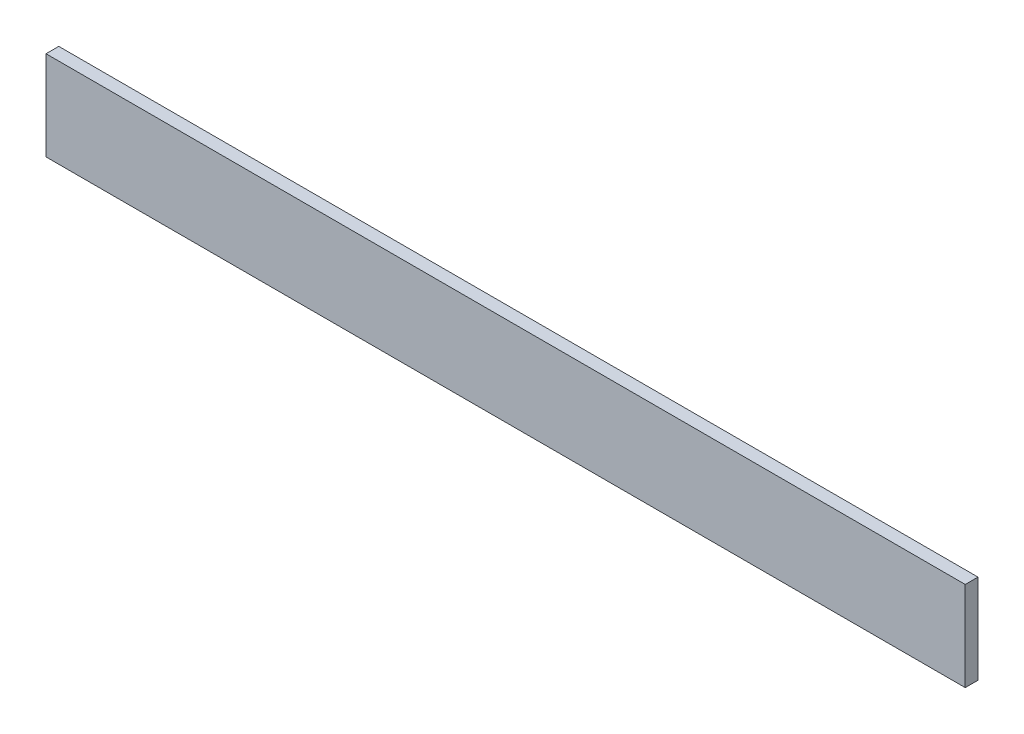
ISO-10303-21;
HEADER;
FILE_DESCRIPTION(('STEP AP214'),'2;1');
FILE_NAME('part.step','',(''),(''),'','','');
FILE_SCHEMA(('AUTOMOTIVE_DESIGN { 1 0 10303 214 1 1 1 1 }'));
ENDSEC;
DATA;
#1=APPLICATION_CONTEXT('core data for automotive mechanical design processes');
#2=APPLICATION_PROTOCOL_DEFINITION('international standard','automotive_design',2000,#1);
#3=PRODUCT_CONTEXT('',#1,'mechanical');
#4=PRODUCT('Part','Part','',(#3));
#5=PRODUCT_RELATED_PRODUCT_CATEGORY('part','',(#4));
#6=PRODUCT_DEFINITION_FORMATION('','',#4);
#7=PRODUCT_DEFINITION_CONTEXT('part definition',#1,'design');
#8=PRODUCT_DEFINITION('design','',#6,#7);
#9=PRODUCT_DEFINITION_SHAPE('','',#8);
#10=(LENGTH_UNIT() NAMED_UNIT(*) SI_UNIT(.MILLI.,.METRE.));
#11=(NAMED_UNIT(*) PLANE_ANGLE_UNIT() SI_UNIT($,.RADIAN.));
#12=(NAMED_UNIT(*) SI_UNIT($,.STERADIAN.) SOLID_ANGLE_UNIT());
#13=UNCERTAINTY_MEASURE_WITH_UNIT(LENGTH_MEASURE(1.E-05),#10,'distance_accuracy_value','');
#14=(GEOMETRIC_REPRESENTATION_CONTEXT(3) GLOBAL_UNCERTAINTY_ASSIGNED_CONTEXT((#13)) GLOBAL_UNIT_ASSIGNED_CONTEXT((#10,
#11,#12)) REPRESENTATION_CONTEXT('',''));
#15=CARTESIAN_POINT('',(0.,0.,0.));
#16=DIRECTION('',(0.,0.,1.));
#17=DIRECTION('',(1.,0.,0.));
#18=AXIS2_PLACEMENT_3D('',#15,#16,#17);
#19=CARTESIAN_POINT('',(0.,0.,2.5));
#20=DIRECTION('',(1.,0.,0.));
#21=DIRECTION('',(0.,0.,-1.));
#22=AXIS2_PLACEMENT_3D('',#19,#20,#21);
#23=PLANE('',#22);
#24=DIRECTION('',(0.,-1.,0.));
#25=VECTOR('',#24,1.);
#26=CARTESIAN_POINT('',(0.,0.,0.));
#27=LINE('',#26,#25);
#28=CARTESIAN_POINT('',(0.,17.5,0.));
#29=VERTEX_POINT('',#28);
#30=CARTESIAN_POINT('',(0.,0.,0.));
#31=VERTEX_POINT('',#30);
#32=EDGE_CURVE('E95',#29,#31,#27,.T.);
#33=ORIENTED_EDGE('',*,*,#32,.T.);
#34=DIRECTION('',(0.,0.,-1.));
#35=VECTOR('',#34,1.);
#36=CARTESIAN_POINT('',(0.,0.,2.5));
#37=LINE('',#36,#35);
#38=CARTESIAN_POINT('',(0.,0.,2.5));
#39=VERTEX_POINT('',#38);
#40=EDGE_CURVE('E11',#39,#31,#37,.T.);
#41=ORIENTED_EDGE('',*,*,#40,.F.);
#42=DIRECTION('',(0.,-1.,0.));
#43=VECTOR('',#42,1.);
#44=CARTESIAN_POINT('',(0.,0.,2.5));
#45=LINE('',#44,#43);
#46=CARTESIAN_POINT('',(0.,17.5,2.5));
#47=VERTEX_POINT('',#46);
#48=EDGE_CURVE('E83',#47,#39,#45,.T.);
#49=ORIENTED_EDGE('',*,*,#48,.F.);
#50=DIRECTION('',(0.,0.,-1.));
#51=VECTOR('',#50,1.);
#52=CARTESIAN_POINT('',(0.,17.5,2.5));
#53=LINE('',#52,#51);
#54=EDGE_CURVE('E91',#47,#29,#53,.T.);
#55=ORIENTED_EDGE('',*,*,#54,.T.);
#56=EDGE_LOOP('',(#33,#41,#49,#55));
#57=FACE_BOUND('',#56,.T.);
#58=ADVANCED_FACE('F32',(#57),#23,.F.);
#59=CARTESIAN_POINT('',(0.,0.,2.5));
#60=DIRECTION('',(0.,1.,0.));
#61=DIRECTION('',(0.,0.,1.));
#62=AXIS2_PLACEMENT_3D('',#59,#60,#61);
#63=PLANE('',#62);
#64=DIRECTION('',(1.,0.,0.));
#65=VECTOR('',#64,1.);
#66=CARTESIAN_POINT('',(0.,0.,0.));
#67=LINE('',#66,#65);
#68=CARTESIAN_POINT('',(180.,0.,0.));
#69=VERTEX_POINT('',#68);
#70=EDGE_CURVE('E87',#31,#69,#67,.T.);
#71=ORIENTED_EDGE('',*,*,#70,.T.);
#72=DIRECTION('',(0.,0.,-1.));
#73=VECTOR('',#72,1.);
#74=CARTESIAN_POINT('',(180.,0.,2.5));
#75=LINE('',#74,#73);
#76=CARTESIAN_POINT('',(180.,0.,2.5));
#77=VERTEX_POINT('',#76);
#78=EDGE_CURVE('E40',#77,#69,#75,.T.);
#79=ORIENTED_EDGE('',*,*,#78,.F.);
#80=DIRECTION('',(1.,0.,0.));
#81=VECTOR('',#80,1.);
#82=CARTESIAN_POINT('',(0.,0.,2.5));
#83=LINE('',#82,#81);
#84=EDGE_CURVE('E78',#39,#77,#83,.T.);
#85=ORIENTED_EDGE('',*,*,#84,.F.);
#86=ORIENTED_EDGE('',*,*,#40,.T.);
#87=EDGE_LOOP('',(#71,#79,#85,#86));
#88=FACE_BOUND('',#87,.T.);
#89=ADVANCED_FACE('F86',(#88),#63,.F.);
#90=CARTESIAN_POINT('',(180.,0.,2.5));
#91=DIRECTION('',(-1.,0.,0.));
#92=DIRECTION('',(0.,0.,1.));
#93=AXIS2_PLACEMENT_3D('',#90,#91,#92);
#94=PLANE('',#93);
#95=DIRECTION('',(0.,1.,0.));
#96=VECTOR('',#95,1.);
#97=CARTESIAN_POINT('',(180.,0.,0.));
#98=LINE('',#97,#96);
#99=CARTESIAN_POINT('',(180.,17.5,0.));
#100=VERTEX_POINT('',#99);
#101=EDGE_CURVE('E65',#69,#100,#98,.T.);
#102=ORIENTED_EDGE('',*,*,#101,.T.);
#103=DIRECTION('',(0.,0.,-1.));
#104=VECTOR('',#103,1.);
#105=CARTESIAN_POINT('',(180.,17.5,2.5));
#106=LINE('',#105,#104);
#107=CARTESIAN_POINT('',(180.,17.5,2.5));
#108=VERTEX_POINT('',#107);
#109=EDGE_CURVE('E88',#108,#100,#106,.T.);
#110=ORIENTED_EDGE('',*,*,#109,.F.);
#111=DIRECTION('',(0.,1.,0.));
#112=VECTOR('',#111,1.);
#113=CARTESIAN_POINT('',(180.,0.,2.5));
#114=LINE('',#113,#112);
#115=EDGE_CURVE('E81',#77,#108,#114,.T.);
#116=ORIENTED_EDGE('',*,*,#115,.F.);
#117=ORIENTED_EDGE('',*,*,#78,.T.);
#118=EDGE_LOOP('',(#102,#110,#116,#117));
#119=FACE_BOUND('',#118,.T.);
#120=ADVANCED_FACE('F89',(#119),#94,.F.);
#121=CARTESIAN_POINT('',(0.,17.5,2.5));
#122=DIRECTION('',(0.,-1.,0.));
#123=DIRECTION('',(0.,0.,-1.));
#124=AXIS2_PLACEMENT_3D('',#121,#122,#123);
#125=PLANE('',#124);
#126=DIRECTION('',(-1.,0.,0.));
#127=VECTOR('',#126,1.);
#128=CARTESIAN_POINT('',(0.,17.5,0.));
#129=LINE('',#128,#127);
#130=EDGE_CURVE('E71',#100,#29,#129,.T.);
#131=ORIENTED_EDGE('',*,*,#130,.T.);
#132=ORIENTED_EDGE('',*,*,#54,.F.);
#133=DIRECTION('',(-1.,0.,0.));
#134=VECTOR('',#133,1.);
#135=CARTESIAN_POINT('',(0.,17.5,2.5));
#136=LINE('',#135,#134);
#137=EDGE_CURVE('E48',#108,#47,#136,.T.);
#138=ORIENTED_EDGE('',*,*,#137,.F.);
#139=ORIENTED_EDGE('',*,*,#109,.T.);
#140=EDGE_LOOP('',(#131,#132,#138,#139));
#141=FACE_BOUND('',#140,.T.);
#142=ADVANCED_FACE('F102',(#141),#125,.F.);
#143=CARTESIAN_POINT('',(0.,0.,2.5));
#144=DIRECTION('',(0.,0.,-1.));
#145=DIRECTION('',(-1.,0.,0.));
#146=AXIS2_PLACEMENT_3D('',#143,#144,#145);
#147=PLANE('',#146);
#148=ORIENTED_EDGE('',*,*,#48,.T.);
#149=ORIENTED_EDGE('',*,*,#84,.T.);
#150=ORIENTED_EDGE('',*,*,#115,.T.);
#151=ORIENTED_EDGE('',*,*,#137,.T.);
#152=EDGE_LOOP('',(#148,#149,#150,#151));
#153=FACE_BOUND('',#152,.T.);
#154=ADVANCED_FACE('F79',(#153),#147,.F.);
#155=CARTESIAN_POINT('',(0.,0.,0.));
#156=DIRECTION('',(0.,0.,-1.));
#157=DIRECTION('',(-1.,0.,0.));
#158=AXIS2_PLACEMENT_3D('',#155,#156,#157);
#159=PLANE('',#158);
#160=ORIENTED_EDGE('',*,*,#32,.F.);
#161=ORIENTED_EDGE('',*,*,#130,.F.);
#162=ORIENTED_EDGE('',*,*,#101,.F.);
#163=ORIENTED_EDGE('',*,*,#70,.F.);
#164=EDGE_LOOP('',(#160,#161,#162,#163));
#165=FACE_BOUND('',#164,.T.);
#166=ADVANCED_FACE('F105',(#165),#159,.T.);
#167=CLOSED_SHELL('',(#58,#89,#120,#142,#154,#166));
#168=MANIFOLD_SOLID_BREP('B2',#167);
#169=ADVANCED_BREP_SHAPE_REPRESENTATION('',(#18,#168),#14);
#170=SHAPE_DEFINITION_REPRESENTATION(#9,#169);
ENDSEC;
END-ISO-10303-21;
